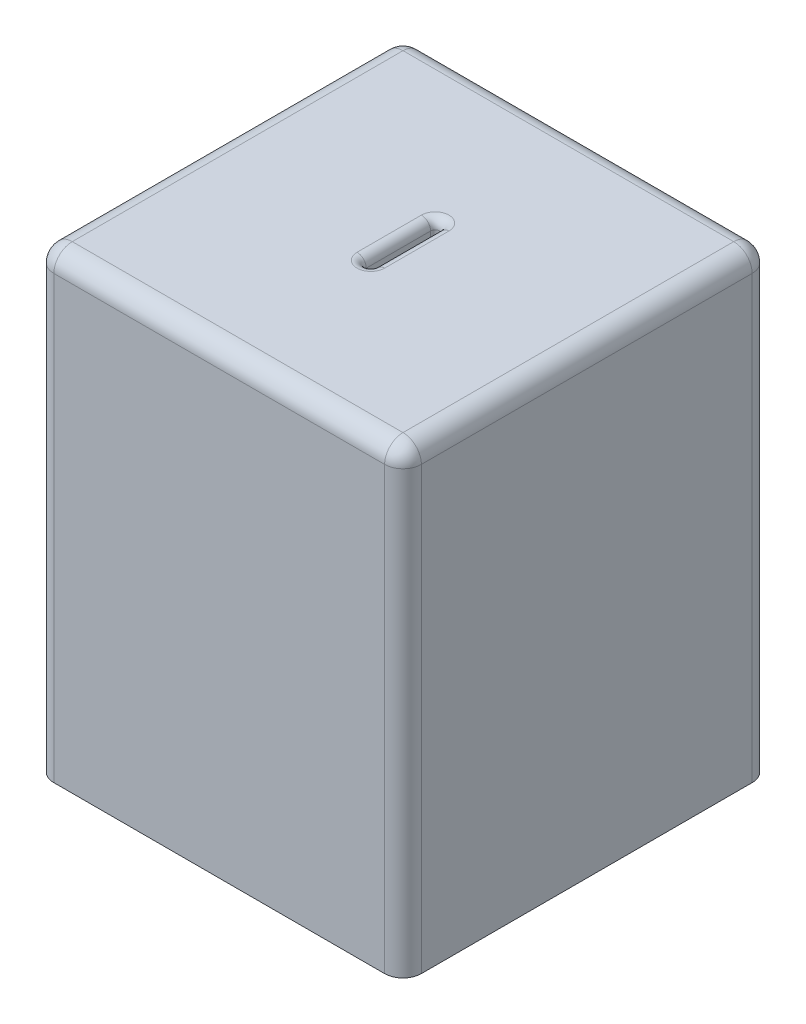
ISO-10303-21;
HEADER;
FILE_DESCRIPTION(('STEP AP214'),'2;1');
FILE_NAME('part.step','',(''),(''),'','','');
FILE_SCHEMA(('AUTOMOTIVE_DESIGN { 1 0 10303 214 1 1 1 1 }'));
ENDSEC;
DATA;
#1=APPLICATION_CONTEXT('core data for automotive mechanical design processes');
#2=APPLICATION_PROTOCOL_DEFINITION('international standard','automotive_design',2000,#1);
#3=PRODUCT_CONTEXT('',#1,'mechanical');
#4=PRODUCT('Part','Part','',(#3));
#5=PRODUCT_RELATED_PRODUCT_CATEGORY('part','',(#4));
#6=PRODUCT_DEFINITION_FORMATION('','',#4);
#7=PRODUCT_DEFINITION_CONTEXT('part definition',#1,'design');
#8=PRODUCT_DEFINITION('design','',#6,#7);
#9=PRODUCT_DEFINITION_SHAPE('','',#8);
#10=(LENGTH_UNIT() NAMED_UNIT(*) SI_UNIT(.MILLI.,.METRE.));
#11=(NAMED_UNIT(*) PLANE_ANGLE_UNIT() SI_UNIT($,.RADIAN.));
#12=(NAMED_UNIT(*) SI_UNIT($,.STERADIAN.) SOLID_ANGLE_UNIT());
#13=UNCERTAINTY_MEASURE_WITH_UNIT(LENGTH_MEASURE(1.E-05),#10,'distance_accuracy_value','');
#14=(GEOMETRIC_REPRESENTATION_CONTEXT(3) GLOBAL_UNCERTAINTY_ASSIGNED_CONTEXT((#13)) GLOBAL_UNIT_ASSIGNED_CONTEXT((#10,
#11,#12)) REPRESENTATION_CONTEXT('',''));
#15=CARTESIAN_POINT('',(0.,0.,0.));
#16=DIRECTION('',(0.,0.,1.));
#17=DIRECTION('',(1.,0.,0.));
#18=AXIS2_PLACEMENT_3D('',#15,#16,#17);
#19=CARTESIAN_POINT('',(-51.8384401114206,250.,-103.064066852368));
#20=DIRECTION('',(1.,0.,0.));
#21=DIRECTION('',(0.,0.,-1.));
#22=AXIS2_PLACEMENT_3D('',#19,#20,#21);
#23=PLANE('',#22);
#24=DIRECTION('',(0.,0.,1.));
#25=VECTOR('',#24,1.);
#26=CARTESIAN_POINT('',(-51.8384401114206,10.,-103.064066852368));
#27=LINE('',#26,#25);
#28=CARTESIAN_POINT('',(-51.8384401114206,10.,-93.0640668523677));
#29=VERTEX_POINT('',#28);
#30=CARTESIAN_POINT('',(-51.8384401114206,10.,86.9359331476323));
#31=VERTEX_POINT('',#30);
#32=EDGE_CURVE('E297',#29,#31,#27,.T.);
#33=ORIENTED_EDGE('',*,*,#32,.F.);
#34=DIRECTION('',(0.,-1.,0.));
#35=VECTOR('',#34,1.);
#36=CARTESIAN_POINT('',(-51.8384401114206,250.,-93.0640668523677));
#37=LINE('',#36,#35);
#38=CARTESIAN_POINT('',(-51.8384401114206,240.,-93.0640668523677));
#39=VERTEX_POINT('',#38);
#40=EDGE_CURVE('E376',#39,#29,#37,.T.);
#41=ORIENTED_EDGE('',*,*,#40,.F.);
#42=DIRECTION('',(0.,0.,1.));
#43=VECTOR('',#42,1.);
#44=CARTESIAN_POINT('',(-51.8384401114206,240.,-103.064066852368));
#45=LINE('',#44,#43);
#46=CARTESIAN_POINT('',(-51.8384401114206,240.,86.9359331476323));
#47=VERTEX_POINT('',#46);
#48=EDGE_CURVE('E343',#39,#47,#45,.T.);
#49=ORIENTED_EDGE('',*,*,#48,.T.);
#50=DIRECTION('',(0.,1.,0.));
#51=VECTOR('',#50,1.);
#52=CARTESIAN_POINT('',(-51.8384401114206,250.,86.9359331476323));
#53=LINE('',#52,#51);
#54=EDGE_CURVE('E380',#31,#47,#53,.T.);
#55=ORIENTED_EDGE('',*,*,#54,.F.);
#56=EDGE_LOOP('',(#33,#41,#49,#55));
#57=FACE_BOUND('',#56,.T.);
#58=ADVANCED_FACE('F45',(#57),#23,.T.);
#59=CARTESIAN_POINT('',(-61.8384401114206,250.,86.9359331476323));
#60=DIRECTION('',(0.,0.,-1.));
#61=DIRECTION('',(-1.,0.,0.));
#62=AXIS2_PLACEMENT_3D('',#59,#60,#61);
#63=PLANE('',#62);
#64=DIRECTION('',(1.,0.,0.));
#65=VECTOR('',#64,1.);
#66=CARTESIAN_POINT('',(-61.8384401114206,10.,86.9359331476323));
#67=LINE('',#66,#65);
#68=CARTESIAN_POINT('',(128.161559888579,10.,86.9359331476323));
#69=VERTEX_POINT('',#68);
#70=EDGE_CURVE('E373',#31,#69,#67,.T.);
#71=ORIENTED_EDGE('',*,*,#70,.F.);
#72=ORIENTED_EDGE('',*,*,#54,.T.);
#73=DIRECTION('',(-1.,0.,0.));
#74=VECTOR('',#73,1.);
#75=CARTESIAN_POINT('',(0.,240.,86.9359331476323));
#76=LINE('',#75,#74);
#77=CARTESIAN_POINT('',(128.161559888579,240.,86.9359331476323));
#78=VERTEX_POINT('',#77);
#79=EDGE_CURVE('E369',#78,#47,#76,.T.);
#80=ORIENTED_EDGE('',*,*,#79,.F.);
#81=DIRECTION('',(0.,-1.,0.));
#82=VECTOR('',#81,1.);
#83=CARTESIAN_POINT('',(128.161559888579,250.,86.9359331476323));
#84=LINE('',#83,#82);
#85=EDGE_CURVE('E354',#78,#69,#84,.T.);
#86=ORIENTED_EDGE('',*,*,#85,.T.);
#87=EDGE_LOOP('',(#71,#72,#80,#86));
#88=FACE_BOUND('',#87,.T.);
#89=ADVANCED_FACE('F532',(#88),#63,.T.);
#90=CARTESIAN_POINT('',(128.161559888579,250.,-103.064066852368));
#91=DIRECTION('',(-1.,0.,0.));
#92=DIRECTION('',(0.,0.,1.));
#93=AXIS2_PLACEMENT_3D('',#90,#91,#92);
#94=PLANE('',#93);
#95=DIRECTION('',(0.,0.,-1.));
#96=VECTOR('',#95,1.);
#97=CARTESIAN_POINT('',(128.161559888579,10.,-103.064066852368));
#98=LINE('',#97,#96);
#99=CARTESIAN_POINT('',(128.161559888579,10.,-93.0640668523677));
#100=VERTEX_POINT('',#99);
#101=EDGE_CURVE('E366',#69,#100,#98,.T.);
#102=ORIENTED_EDGE('',*,*,#101,.F.);
#103=ORIENTED_EDGE('',*,*,#85,.F.);
#104=DIRECTION('',(0.,0.,1.));
#105=VECTOR('',#104,1.);
#106=CARTESIAN_POINT('',(128.161559888579,240.,0.));
#107=LINE('',#106,#105);
#108=CARTESIAN_POINT('',(128.161559888579,240.,-93.0640668523677));
#109=VERTEX_POINT('',#108);
#110=EDGE_CURVE('E358',#109,#78,#107,.T.);
#111=ORIENTED_EDGE('',*,*,#110,.F.);
#112=DIRECTION('',(0.,1.,0.));
#113=VECTOR('',#112,1.);
#114=CARTESIAN_POINT('',(128.161559888579,250.,-93.0640668523677));
#115=LINE('',#114,#113);
#116=EDGE_CURVE('E362',#100,#109,#115,.T.);
#117=ORIENTED_EDGE('',*,*,#116,.F.);
#118=EDGE_LOOP('',(#102,#103,#111,#117));
#119=FACE_BOUND('',#118,.T.);
#120=ADVANCED_FACE('F539',(#119),#94,.T.);
#121=CARTESIAN_POINT('',(-61.8384401114206,250.,-93.0640668523677));
#122=DIRECTION('',(0.,0.,1.));
#123=DIRECTION('',(1.,0.,0.));
#124=AXIS2_PLACEMENT_3D('',#121,#122,#123);
#125=PLANE('',#124);
#126=DIRECTION('',(-1.,0.,0.));
#127=VECTOR('',#126,1.);
#128=CARTESIAN_POINT('',(-61.8384401114206,240.,-93.0640668523677));
#129=LINE('',#128,#127);
#130=EDGE_CURVE('E347',#109,#39,#129,.T.);
#131=ORIENTED_EDGE('',*,*,#130,.T.);
#132=ORIENTED_EDGE('',*,*,#40,.T.);
#133=DIRECTION('',(-1.,0.,0.));
#134=VECTOR('',#133,1.);
#135=CARTESIAN_POINT('',(-61.8384401114206,10.,-93.0640668523677));
#136=LINE('',#135,#134);
#137=EDGE_CURVE('E351',#100,#29,#136,.T.);
#138=ORIENTED_EDGE('',*,*,#137,.F.);
#139=ORIENTED_EDGE('',*,*,#116,.T.);
#140=EDGE_LOOP('',(#131,#132,#138,#139));
#141=FACE_BOUND('',#140,.T.);
#142=ADVANCED_FACE('F548',(#141),#125,.T.);
#143=CARTESIAN_POINT('',(0.,240.,0.));
#144=DIRECTION('',(0.,1.,0.));
#145=DIRECTION('',(0.,0.,1.));
#146=AXIS2_PLACEMENT_3D('',#143,#144,#145);
#147=PLANE('',#146);
#148=DIRECTION('',(0.,0.,1.));
#149=VECTOR('',#148,1.);
#150=CARTESIAN_POINT('',(40.6615598885794,240.,-20.5640668523677));
#151=LINE('',#150,#149);
#152=CARTESIAN_POINT('',(40.6615598885794,240.,-20.5640668523677));
#153=VERTEX_POINT('',#152);
#154=CARTESIAN_POINT('',(40.6615598885794,240.,14.4359331476323));
#155=VERTEX_POINT('',#154);
#156=EDGE_CURVE('E185',#153,#155,#151,.T.);
#157=ORIENTED_EDGE('',*,*,#156,.F.);
#158=CARTESIAN_POINT('',(38.1615598885794,240.,-20.5640668523677));
#159=DIRECTION('',(0.,1.,0.));
#160=DIRECTION('',(0.,0.,1.));
#161=AXIS2_PLACEMENT_3D('',#158,#159,#160);
#162=CIRCLE('',#161,2.5);
#163=CARTESIAN_POINT('',(35.6615598885794,240.,-20.5640668523677));
#164=VERTEX_POINT('',#163);
#165=EDGE_CURVE('E192',#164,#153,#162,.F.);
#166=ORIENTED_EDGE('',*,*,#165,.F.);
#167=DIRECTION('',(0.,0.,-1.));
#168=VECTOR('',#167,1.);
#169=CARTESIAN_POINT('',(35.6615598885794,240.,-20.5640668523677));
#170=LINE('',#169,#168);
#171=CARTESIAN_POINT('',(35.6615598885794,240.,14.4359331476323));
#172=VERTEX_POINT('',#171);
#173=EDGE_CURVE('E198',#172,#164,#170,.T.);
#174=ORIENTED_EDGE('',*,*,#173,.F.);
#175=CARTESIAN_POINT('',(38.1615598885794,240.,14.4359331476323));
#176=DIRECTION('',(0.,1.,0.));
#177=DIRECTION('',(0.,0.,1.));
#178=AXIS2_PLACEMENT_3D('',#175,#176,#177);
#179=CIRCLE('',#178,2.5);
#180=EDGE_CURVE('E202',#155,#172,#179,.F.);
#181=ORIENTED_EDGE('',*,*,#180,.F.);
#182=EDGE_LOOP('',(#157,#166,#174,#181));
#183=FACE_BOUND('',#182,.T.);
#184=ORIENTED_EDGE('',*,*,#79,.T.);
#185=ORIENTED_EDGE('',*,*,#48,.F.);
#186=ORIENTED_EDGE('',*,*,#130,.F.);
#187=ORIENTED_EDGE('',*,*,#110,.T.);
#188=EDGE_LOOP('',(#184,#185,#186,#187));
#189=FACE_BOUND('',#188,.T.);
#190=ADVANCED_FACE('F200',(#183,#189),#147,.F.);
#191=CARTESIAN_POINT('',(0.,10.,0.));
#192=DIRECTION('',(0.,1.,0.));
#193=DIRECTION('',(0.,0.,1.));
#194=AXIS2_PLACEMENT_3D('',#191,#192,#193);
#195=PLANE('',#194);
#196=CARTESIAN_POINT('',(38.1615598885794,10.,-3.06406685236769));
#197=DIRECTION('',(0.,1.,0.));
#198=DIRECTION('',(0.,0.,1.));
#199=AXIS2_PLACEMENT_3D('',#196,#197,#198);
#200=CIRCLE('',#199,20.);
#201=CARTESIAN_POINT('',(38.1615598885794,10.,16.9359331476323));
#202=VERTEX_POINT('',#201);
#203=EDGE_CURVE('E432',#202,#202,#200,.F.);
#204=ORIENTED_EDGE('',*,*,#203,.T.);
#205=EDGE_LOOP('',(#204));
#206=FACE_BOUND('',#205,.T.);
#207=ORIENTED_EDGE('',*,*,#137,.T.);
#208=ORIENTED_EDGE('',*,*,#32,.T.);
#209=ORIENTED_EDGE('',*,*,#70,.T.);
#210=ORIENTED_EDGE('',*,*,#101,.T.);
#211=EDGE_LOOP('',(#207,#208,#209,#210));
#212=FACE_BOUND('',#211,.T.);
#213=ADVANCED_FACE('F437',(#206,#212),#195,.T.);
#214=CARTESIAN_POINT('',(38.1615598885794,-0.000999999999973245,-20.5640668523677));
#215=DIRECTION('',(0.,1.,0.));
#216=DIRECTION('',(0.,0.,1.));
#217=AXIS2_PLACEMENT_3D('',#214,#215,#216);
#218=CYLINDRICAL_SURFACE('',#217,2.5);
#219=DIRECTION('',(0.,1.,0.));
#220=VECTOR('',#219,1.);
#221=CARTESIAN_POINT('',(40.6615598885794,-0.000999999999973245,-20.5640668523677));
#222=LINE('',#221,#220);
#223=CARTESIAN_POINT('',(40.6615598885794,245.,-20.5640668523677));
#224=VERTEX_POINT('',#223);
#225=EDGE_CURVE('E181',#153,#224,#222,.T.);
#226=ORIENTED_EDGE('',*,*,#225,.T.);
#227=CARTESIAN_POINT('',(38.1615598885794,245.,-20.5640668523677));
#228=DIRECTION('',(0.,1.,0.));
#229=DIRECTION('',(0.,0.,1.));
#230=AXIS2_PLACEMENT_3D('',#227,#228,#229);
#231=CIRCLE('',#230,2.5);
#232=CARTESIAN_POINT('',(35.6615598885794,245.,-20.5640668523677));
#233=VERTEX_POINT('',#232);
#234=EDGE_CURVE('E55',#224,#233,#231,.T.);
#235=ORIENTED_EDGE('',*,*,#234,.T.);
#236=DIRECTION('',(0.,1.,0.));
#237=VECTOR('',#236,1.);
#238=CARTESIAN_POINT('',(35.6615598885794,-0.000999999999973245,-20.5640668523677));
#239=LINE('',#238,#237);
#240=EDGE_CURVE('E189',#164,#233,#239,.T.);
#241=ORIENTED_EDGE('',*,*,#240,.F.);
#242=ORIENTED_EDGE('',*,*,#165,.T.);
#243=EDGE_LOOP('',(#226,#235,#241,#242));
#244=FACE_BOUND('',#243,.T.);
#245=ADVANCED_FACE('F193',(#244),#218,.F.);
#246=CARTESIAN_POINT('',(40.6615598885794,-0.000999999999973245,-20.5640668523677));
#247=DIRECTION('',(1.,0.,0.));
#248=DIRECTION('',(0.,0.,-1.));
#249=AXIS2_PLACEMENT_3D('',#246,#247,#248);
#250=PLANE('',#249);
#251=DIRECTION('',(0.,1.,0.));
#252=VECTOR('',#251,1.);
#253=CARTESIAN_POINT('',(40.6615598885794,-0.000999999999973245,14.4359331476323));
#254=LINE('',#253,#252);
#255=CARTESIAN_POINT('',(40.6615598885794,245.,14.4359331476323));
#256=VERTEX_POINT('',#255);
#257=EDGE_CURVE('E188',#155,#256,#254,.T.);
#258=ORIENTED_EDGE('',*,*,#257,.T.);
#259=DIRECTION('',(0.,0.,-1.));
#260=VECTOR('',#259,1.);
#261=CARTESIAN_POINT('',(40.6615598885794,245.,-20.5640668523677));
#262=LINE('',#261,#260);
#263=EDGE_CURVE('E11',#256,#224,#262,.T.);
#264=ORIENTED_EDGE('',*,*,#263,.T.);
#265=ORIENTED_EDGE('',*,*,#225,.F.);
#266=ORIENTED_EDGE('',*,*,#156,.T.);
#267=EDGE_LOOP('',(#258,#264,#265,#266));
#268=FACE_BOUND('',#267,.T.);
#269=ADVANCED_FACE('F183',(#268),#250,.F.);
#270=CARTESIAN_POINT('',(38.1615598885794,-0.000999999999973245,14.4359331476323));
#271=DIRECTION('',(0.,1.,0.));
#272=DIRECTION('',(0.,0.,1.));
#273=AXIS2_PLACEMENT_3D('',#270,#271,#272);
#274=CYLINDRICAL_SURFACE('',#273,2.5);
#275=DIRECTION('',(0.,1.,0.));
#276=VECTOR('',#275,1.);
#277=CARTESIAN_POINT('',(35.6615598885794,-0.000999999999973245,14.4359331476323));
#278=LINE('',#277,#276);
#279=CARTESIAN_POINT('',(35.6615598885794,245.,14.4359331476323));
#280=VERTEX_POINT('',#279);
#281=EDGE_CURVE('E211',#172,#280,#278,.T.);
#282=ORIENTED_EDGE('',*,*,#281,.T.);
#283=CARTESIAN_POINT('',(38.1615598885794,245.,14.4359331476323));
#284=DIRECTION('',(0.,1.,0.));
#285=DIRECTION('',(0.,0.,1.));
#286=AXIS2_PLACEMENT_3D('',#283,#284,#285);
#287=CIRCLE('',#286,2.5);
#288=EDGE_CURVE('E346',#280,#256,#287,.T.);
#289=ORIENTED_EDGE('',*,*,#288,.T.);
#290=ORIENTED_EDGE('',*,*,#257,.F.);
#291=ORIENTED_EDGE('',*,*,#180,.T.);
#292=EDGE_LOOP('',(#282,#289,#290,#291));
#293=FACE_BOUND('',#292,.T.);
#294=ADVANCED_FACE('F528',(#293),#274,.F.);
#295=CARTESIAN_POINT('',(35.6615598885794,-0.000999999999973245,-20.5640668523677));
#296=DIRECTION('',(-1.,0.,0.));
#297=DIRECTION('',(0.,0.,1.));
#298=AXIS2_PLACEMENT_3D('',#295,#296,#297);
#299=PLANE('',#298);
#300=ORIENTED_EDGE('',*,*,#240,.T.);
#301=DIRECTION('',(0.,0.,1.));
#302=VECTOR('',#301,1.);
#303=CARTESIAN_POINT('',(35.6615598885794,245.,14.4359331476323));
#304=LINE('',#303,#302);
#305=EDGE_CURVE('E402',#233,#280,#304,.T.);
#306=ORIENTED_EDGE('',*,*,#305,.T.);
#307=ORIENTED_EDGE('',*,*,#281,.F.);
#308=ORIENTED_EDGE('',*,*,#173,.T.);
#309=EDGE_LOOP('',(#300,#306,#307,#308));
#310=FACE_BOUND('',#309,.T.);
#311=ADVANCED_FACE('F521',(#310),#299,.F.);
#312=CARTESIAN_POINT('',(-61.8384401114206,250.,-103.064066852368));
#313=DIRECTION('',(1.,0.,0.));
#314=DIRECTION('',(0.,0.,-1.));
#315=AXIS2_PLACEMENT_3D('',#312,#313,#314);
#316=PLANE('',#315);
#317=DIRECTION('',(0.,0.,1.));
#318=VECTOR('',#317,1.);
#319=CARTESIAN_POINT('',(-61.8384401114206,0.,-103.064066852368));
#320=LINE('',#319,#318);
#321=CARTESIAN_POINT('',(-61.8384401114206,0.,-93.0640668523677));
#322=VERTEX_POINT('',#321);
#323=CARTESIAN_POINT('',(-61.8384401114206,0.,86.9359331476323));
#324=VERTEX_POINT('',#323);
#325=EDGE_CURVE('E218',#322,#324,#320,.T.);
#326=ORIENTED_EDGE('',*,*,#325,.T.);
#327=DIRECTION('',(0.,-1.,0.));
#328=VECTOR('',#327,1.);
#329=CARTESIAN_POINT('',(-61.8384401114206,250.,86.9359331476323));
#330=LINE('',#329,#328);
#331=CARTESIAN_POINT('',(-61.8384401114206,240.,86.9359331476323));
#332=VERTEX_POINT('',#331);
#333=EDGE_CURVE('E281',#324,#332,#330,.F.);
#334=ORIENTED_EDGE('',*,*,#333,.T.);
#335=DIRECTION('',(0.,0.,1.));
#336=VECTOR('',#335,1.);
#337=CARTESIAN_POINT('',(-61.8384401114206,240.,-103.064066852368));
#338=LINE('',#337,#336);
#339=CARTESIAN_POINT('',(-61.8384401114206,240.,-93.0640668523677));
#340=VERTEX_POINT('',#339);
#341=EDGE_CURVE('E275',#332,#340,#338,.F.);
#342=ORIENTED_EDGE('',*,*,#341,.T.);
#343=DIRECTION('',(0.,-1.,0.));
#344=VECTOR('',#343,1.);
#345=CARTESIAN_POINT('',(-61.8384401114206,250.,-93.0640668523677));
#346=LINE('',#345,#344);
#347=EDGE_CURVE('E278',#340,#322,#346,.T.);
#348=ORIENTED_EDGE('',*,*,#347,.T.);
#349=EDGE_LOOP('',(#326,#334,#342,#348));
#350=FACE_BOUND('',#349,.T.);
#351=ADVANCED_FACE('F519',(#350),#316,.F.);
#352=CARTESIAN_POINT('',(-61.8384401114206,250.,96.9359331476323));
#353=DIRECTION('',(0.,0.,-1.));
#354=DIRECTION('',(-1.,0.,0.));
#355=AXIS2_PLACEMENT_3D('',#352,#353,#354);
#356=PLANE('',#355);
#357=DIRECTION('',(1.,0.,0.));
#358=VECTOR('',#357,1.);
#359=CARTESIAN_POINT('',(-61.8384401114206,0.,96.9359331476323));
#360=LINE('',#359,#358);
#361=CARTESIAN_POINT('',(-51.8384401114206,0.,96.9359331476323));
#362=VERTEX_POINT('',#361);
#363=CARTESIAN_POINT('',(128.161559888579,0.,96.9359331476323));
#364=VERTEX_POINT('',#363);
#365=EDGE_CURVE('E222',#362,#364,#360,.T.);
#366=ORIENTED_EDGE('',*,*,#365,.T.);
#367=DIRECTION('',(0.,-1.,0.));
#368=VECTOR('',#367,1.);
#369=CARTESIAN_POINT('',(128.161559888579,250.,96.9359331476323));
#370=LINE('',#369,#368);
#371=CARTESIAN_POINT('',(128.161559888579,240.,96.9359331476323));
#372=VERTEX_POINT('',#371);
#373=EDGE_CURVE('E272',#364,#372,#370,.F.);
#374=ORIENTED_EDGE('',*,*,#373,.T.);
#375=DIRECTION('',(1.,0.,0.));
#376=VECTOR('',#375,1.);
#377=CARTESIAN_POINT('',(-61.8384401114206,240.,96.9359331476323));
#378=LINE('',#377,#376);
#379=CARTESIAN_POINT('',(-51.8384401114206,240.,96.9359331476323));
#380=VERTEX_POINT('',#379);
#381=EDGE_CURVE('E266',#372,#380,#378,.F.);
#382=ORIENTED_EDGE('',*,*,#381,.T.);
#383=DIRECTION('',(0.,-1.,0.));
#384=VECTOR('',#383,1.);
#385=CARTESIAN_POINT('',(-51.8384401114206,250.,96.9359331476323));
#386=LINE('',#385,#384);
#387=EDGE_CURVE('E269',#380,#362,#386,.T.);
#388=ORIENTED_EDGE('',*,*,#387,.T.);
#389=EDGE_LOOP('',(#366,#374,#382,#388));
#390=FACE_BOUND('',#389,.T.);
#391=ADVANCED_FACE('F500',(#390),#356,.F.);
#392=CARTESIAN_POINT('',(138.161559888579,250.,-103.064066852368));
#393=DIRECTION('',(-1.,0.,0.));
#394=DIRECTION('',(0.,0.,1.));
#395=AXIS2_PLACEMENT_3D('',#392,#393,#394);
#396=PLANE('',#395);
#397=DIRECTION('',(0.,0.,-1.));
#398=VECTOR('',#397,1.);
#399=CARTESIAN_POINT('',(138.161559888579,0.,-103.064066852368));
#400=LINE('',#399,#398);
#401=CARTESIAN_POINT('',(138.161559888579,0.,86.9359331476323));
#402=VERTEX_POINT('',#401);
#403=CARTESIAN_POINT('',(138.161559888579,0.,-93.0640668523677));
#404=VERTEX_POINT('',#403);
#405=EDGE_CURVE('E227',#402,#404,#400,.T.);
#406=ORIENTED_EDGE('',*,*,#405,.T.);
#407=DIRECTION('',(0.,-1.,0.));
#408=VECTOR('',#407,1.);
#409=CARTESIAN_POINT('',(138.161559888579,250.,-93.0640668523677));
#410=LINE('',#409,#408);
#411=CARTESIAN_POINT('',(138.161559888579,240.,-93.0640668523677));
#412=VERTEX_POINT('',#411);
#413=EDGE_CURVE('E263',#404,#412,#410,.F.);
#414=ORIENTED_EDGE('',*,*,#413,.T.);
#415=DIRECTION('',(0.,0.,-1.));
#416=VECTOR('',#415,1.);
#417=CARTESIAN_POINT('',(138.161559888579,240.,96.9359331476323));
#418=LINE('',#417,#416);
#419=CARTESIAN_POINT('',(138.161559888579,240.,86.9359331476323));
#420=VERTEX_POINT('',#419);
#421=EDGE_CURVE('E257',#412,#420,#418,.F.);
#422=ORIENTED_EDGE('',*,*,#421,.T.);
#423=DIRECTION('',(0.,-1.,0.));
#424=VECTOR('',#423,1.);
#425=CARTESIAN_POINT('',(138.161559888579,250.,86.9359331476323));
#426=LINE('',#425,#424);
#427=EDGE_CURVE('E260',#420,#402,#426,.T.);
#428=ORIENTED_EDGE('',*,*,#427,.T.);
#429=EDGE_LOOP('',(#406,#414,#422,#428));
#430=FACE_BOUND('',#429,.T.);
#431=ADVANCED_FACE('F483',(#430),#396,.F.);
#432=CARTESIAN_POINT('',(-61.8384401114206,250.,-103.064066852368));
#433=DIRECTION('',(0.,0.,1.));
#434=DIRECTION('',(1.,0.,0.));
#435=AXIS2_PLACEMENT_3D('',#432,#433,#434);
#436=PLANE('',#435);
#437=DIRECTION('',(-1.,0.,0.));
#438=VECTOR('',#437,1.);
#439=CARTESIAN_POINT('',(138.161559888579,240.,-103.064066852368));
#440=LINE('',#439,#438);
#441=CARTESIAN_POINT('',(-51.8384401114206,240.,-103.064066852368));
#442=VERTEX_POINT('',#441);
#443=CARTESIAN_POINT('',(128.161559888579,240.,-103.064066852368));
#444=VERTEX_POINT('',#443);
#445=EDGE_CURVE('E235',#442,#444,#440,.F.);
#446=ORIENTED_EDGE('',*,*,#445,.T.);
#447=DIRECTION('',(0.,-1.,0.));
#448=VECTOR('',#447,1.);
#449=CARTESIAN_POINT('',(128.161559888579,250.,-103.064066852368));
#450=LINE('',#449,#448);
#451=CARTESIAN_POINT('',(128.161559888579,0.,-103.064066852368));
#452=VERTEX_POINT('',#451);
#453=EDGE_CURVE('E241',#444,#452,#450,.T.);
#454=ORIENTED_EDGE('',*,*,#453,.T.);
#455=DIRECTION('',(-1.,0.,0.));
#456=VECTOR('',#455,1.);
#457=CARTESIAN_POINT('',(-61.8384401114206,0.,-103.064066852368));
#458=LINE('',#457,#456);
#459=CARTESIAN_POINT('',(-51.8384401114206,0.,-103.064066852368));
#460=VERTEX_POINT('',#459);
#461=EDGE_CURVE('E231',#452,#460,#458,.T.);
#462=ORIENTED_EDGE('',*,*,#461,.T.);
#463=DIRECTION('',(0.,-1.,0.));
#464=VECTOR('',#463,1.);
#465=CARTESIAN_POINT('',(-51.8384401114206,250.,-103.064066852368));
#466=LINE('',#465,#464);
#467=EDGE_CURVE('E238',#460,#442,#466,.F.);
#468=ORIENTED_EDGE('',*,*,#467,.T.);
#469=EDGE_LOOP('',(#446,#454,#462,#468));
#470=FACE_BOUND('',#469,.T.);
#471=ADVANCED_FACE('F459',(#470),#436,.F.);
#472=CARTESIAN_POINT('',(0.,250.,0.));
#473=DIRECTION('',(0.,1.,0.));
#474=DIRECTION('',(0.,0.,1.));
#475=AXIS2_PLACEMENT_3D('',#472,#473,#474);
#476=PLANE('',#475);
#477=DIRECTION('',(0.,0.,-1.));
#478=VECTOR('',#477,1.);
#479=CARTESIAN_POINT('',(45.6615598885794,250.,14.4359331476323));
#480=LINE('',#479,#478);
#481=CARTESIAN_POINT('',(45.6615598885794,250.,-20.5640668523677));
#482=VERTEX_POINT('',#481);
#483=CARTESIAN_POINT('',(45.6615598885794,250.,14.4359331476323));
#484=VERTEX_POINT('',#483);
#485=EDGE_CURVE('E389',#482,#484,#480,.F.);
#486=ORIENTED_EDGE('',*,*,#485,.T.);
#487=CARTESIAN_POINT('',(38.1615598885794,250.,14.4359331476323));
#488=DIRECTION('',(0.,1.,0.));
#489=DIRECTION('',(0.,0.,1.));
#490=AXIS2_PLACEMENT_3D('',#487,#488,#489);
#491=CIRCLE('',#490,7.5);
#492=CARTESIAN_POINT('',(30.6615598885794,250.,14.4359331476323));
#493=VERTEX_POINT('',#492);
#494=EDGE_CURVE('E398',#484,#493,#491,.F.);
#495=ORIENTED_EDGE('',*,*,#494,.T.);
#496=DIRECTION('',(0.,0.,1.));
#497=VECTOR('',#496,1.);
#498=CARTESIAN_POINT('',(30.6615598885794,250.,-20.5640668523677));
#499=LINE('',#498,#497);
#500=CARTESIAN_POINT('',(30.6615598885794,250.,-20.5640668523677));
#501=VERTEX_POINT('',#500);
#502=EDGE_CURVE('E395',#493,#501,#499,.F.);
#503=ORIENTED_EDGE('',*,*,#502,.T.);
#504=CARTESIAN_POINT('',(38.1615598885794,250.,-20.5640668523677));
#505=DIRECTION('',(0.,1.,0.));
#506=DIRECTION('',(0.,0.,1.));
#507=AXIS2_PLACEMENT_3D('',#504,#505,#506);
#508=CIRCLE('',#507,7.5);
#509=EDGE_CURVE('E392',#501,#482,#508,.F.);
#510=ORIENTED_EDGE('',*,*,#509,.T.);
#511=EDGE_LOOP('',(#486,#495,#503,#510));
#512=FACE_BOUND('',#511,.T.);
#513=DIRECTION('',(1.,0.,0.));
#514=VECTOR('',#513,1.);
#515=CARTESIAN_POINT('',(138.161559888579,250.,86.9359331476323));
#516=LINE('',#515,#514);
#517=CARTESIAN_POINT('',(-51.8384401114206,250.,86.9359331476323));
#518=VERTEX_POINT('',#517);
#519=CARTESIAN_POINT('',(128.161559888579,250.,86.9359331476323));
#520=VERTEX_POINT('',#519);
#521=EDGE_CURVE('E284',#518,#520,#516,.T.);
#522=ORIENTED_EDGE('',*,*,#521,.T.);
#523=DIRECTION('',(0.,0.,-1.));
#524=VECTOR('',#523,1.);
#525=CARTESIAN_POINT('',(128.161559888579,250.,-103.064066852368));
#526=LINE('',#525,#524);
#527=CARTESIAN_POINT('',(128.161559888579,250.,-93.0640668523677));
#528=VERTEX_POINT('',#527);
#529=EDGE_CURVE('E293',#520,#528,#526,.T.);
#530=ORIENTED_EDGE('',*,*,#529,.T.);
#531=DIRECTION('',(-1.,0.,0.));
#532=VECTOR('',#531,1.);
#533=CARTESIAN_POINT('',(-61.8384401114206,250.,-93.0640668523677));
#534=LINE('',#533,#532);
#535=CARTESIAN_POINT('',(-51.8384401114206,250.,-93.0640668523677));
#536=VERTEX_POINT('',#535);
#537=EDGE_CURVE('E290',#528,#536,#534,.T.);
#538=ORIENTED_EDGE('',*,*,#537,.T.);
#539=DIRECTION('',(0.,0.,1.));
#540=VECTOR('',#539,1.);
#541=CARTESIAN_POINT('',(-51.8384401114206,250.,96.9359331476323));
#542=LINE('',#541,#540);
#543=EDGE_CURVE('E287',#536,#518,#542,.T.);
#544=ORIENTED_EDGE('',*,*,#543,.T.);
#545=EDGE_LOOP('',(#522,#530,#538,#544));
#546=FACE_BOUND('',#545,.T.);
#547=ADVANCED_FACE('F451',(#512,#546),#476,.T.);
#548=CARTESIAN_POINT('',(0.,0.,0.));
#549=DIRECTION('',(0.,1.,0.));
#550=DIRECTION('',(0.,0.,1.));
#551=AXIS2_PLACEMENT_3D('',#548,#549,#550);
#552=PLANE('',#551);
#553=CARTESIAN_POINT('',(38.1615598885794,0.,-3.06406685236769));
#554=DIRECTION('',(0.,-1.,0.));
#555=DIRECTION('',(0.,0.,-1.));
#556=AXIS2_PLACEMENT_3D('',#553,#554,#555);
#557=CIRCLE('',#556,20.);
#558=CARTESIAN_POINT('',(38.1615598885794,0.,-23.0640668523677));
#559=VERTEX_POINT('',#558);
#560=EDGE_CURVE('E411',#559,#559,#557,.T.);
#561=ORIENTED_EDGE('',*,*,#560,.F.);
#562=EDGE_LOOP('',(#561));
#563=FACE_BOUND('',#562,.T.);
#564=ORIENTED_EDGE('',*,*,#461,.F.);
#565=CARTESIAN_POINT('',(128.161559888579,0.,-93.0640668523677));
#566=DIRECTION('',(0.,1.,0.));
#567=DIRECTION('',(0.,0.,1.));
#568=AXIS2_PLACEMENT_3D('',#565,#566,#567);
#569=CIRCLE('',#568,10.);
#570=EDGE_CURVE('E254',#452,#404,#569,.F.);
#571=ORIENTED_EDGE('',*,*,#570,.T.);
#572=ORIENTED_EDGE('',*,*,#405,.F.);
#573=CARTESIAN_POINT('',(128.161559888579,0.,86.9359331476323));
#574=DIRECTION('',(0.,1.,0.));
#575=DIRECTION('',(0.,0.,1.));
#576=AXIS2_PLACEMENT_3D('',#573,#574,#575);
#577=CIRCLE('',#576,10.);
#578=EDGE_CURVE('E251',#402,#364,#577,.F.);
#579=ORIENTED_EDGE('',*,*,#578,.T.);
#580=ORIENTED_EDGE('',*,*,#365,.F.);
#581=CARTESIAN_POINT('',(-51.8384401114206,0.,86.9359331476323));
#582=DIRECTION('',(0.,1.,0.));
#583=DIRECTION('',(0.,0.,1.));
#584=AXIS2_PLACEMENT_3D('',#581,#582,#583);
#585=CIRCLE('',#584,10.);
#586=EDGE_CURVE('E248',#362,#324,#585,.F.);
#587=ORIENTED_EDGE('',*,*,#586,.T.);
#588=ORIENTED_EDGE('',*,*,#325,.F.);
#589=CARTESIAN_POINT('',(-51.8384401114206,0.,-93.0640668523677));
#590=DIRECTION('',(0.,1.,0.));
#591=DIRECTION('',(0.,0.,1.));
#592=AXIS2_PLACEMENT_3D('',#589,#590,#591);
#593=CIRCLE('',#592,10.);
#594=EDGE_CURVE('E245',#322,#460,#593,.F.);
#595=ORIENTED_EDGE('',*,*,#594,.T.);
#596=EDGE_LOOP('',(#564,#571,#572,#579,#580,#587,#588,#595));
#597=FACE_BOUND('',#596,.T.);
#598=ADVANCED_FACE('F447',(#563,#597),#552,.F.);
#599=CARTESIAN_POINT('',(-51.8384401114206,250.,86.9359331476323));
#600=DIRECTION('',(0.,-1.,0.));
#601=DIRECTION('',(0.,0.,-1.));
#602=AXIS2_PLACEMENT_3D('',#599,#600,#601);
#603=CYLINDRICAL_SURFACE('',#602,10.);
#604=CARTESIAN_POINT('',(-51.8384401114206,240.,86.9359331476323));
#605=DIRECTION('',(0.,1.,0.));
#606=DIRECTION('',(0.,0.,1.));
#607=AXIS2_PLACEMENT_3D('',#604,#605,#606);
#608=CIRCLE('',#607,10.);
#609=EDGE_CURVE('E223',#332,#380,#608,.T.);
#610=ORIENTED_EDGE('',*,*,#609,.F.);
#611=ORIENTED_EDGE('',*,*,#333,.F.);
#612=ORIENTED_EDGE('',*,*,#586,.F.);
#613=ORIENTED_EDGE('',*,*,#387,.F.);
#614=EDGE_LOOP('',(#610,#611,#612,#613));
#615=FACE_BOUND('',#614,.T.);
#616=ADVANCED_FACE('F450',(#615),#603,.T.);
#617=CARTESIAN_POINT('',(-51.8384401114206,240.,86.9359331476323));
#618=DIRECTION('',(0.,0.,1.));
#619=DIRECTION('',(1.,0.,0.));
#620=AXIS2_PLACEMENT_3D('',#617,#618,#619);
#621=SPHERICAL_SURFACE('',#620,10.);
#622=CARTESIAN_POINT('',(-51.8384401114206,240.,86.9359331476323));
#623=DIRECTION('',(0.,0.,1.));
#624=DIRECTION('',(1.,0.,0.));
#625=AXIS2_PLACEMENT_3D('',#622,#623,#624);
#626=CIRCLE('',#625,10.);
#627=EDGE_CURVE('E332',#332,#518,#626,.F.);
#628=ORIENTED_EDGE('',*,*,#627,.F.);
#629=ORIENTED_EDGE('',*,*,#609,.T.);
#630=CARTESIAN_POINT('',(-51.8384401114206,240.,86.9359331476323));
#631=DIRECTION('',(-1.,0.,0.));
#632=DIRECTION('',(0.,0.,1.));
#633=AXIS2_PLACEMENT_3D('',#630,#631,#632);
#634=CIRCLE('',#633,10.);
#635=EDGE_CURVE('E336',#518,#380,#634,.F.);
#636=ORIENTED_EDGE('',*,*,#635,.F.);
#637=EDGE_LOOP('',(#628,#629,#636));
#638=FACE_BOUND('',#637,.T.);
#639=ADVANCED_FACE('F509',(#638),#621,.T.);
#640=CARTESIAN_POINT('',(128.161559888579,250.,86.9359331476323));
#641=DIRECTION('',(0.,-1.,0.));
#642=DIRECTION('',(0.,0.,-1.));
#643=AXIS2_PLACEMENT_3D('',#640,#641,#642);
#644=CYLINDRICAL_SURFACE('',#643,10.);
#645=ORIENTED_EDGE('',*,*,#578,.F.);
#646=ORIENTED_EDGE('',*,*,#427,.F.);
#647=CARTESIAN_POINT('',(128.161559888579,240.,86.9359331476323));
#648=DIRECTION('',(0.,1.,0.));
#649=DIRECTION('',(0.,0.,1.));
#650=AXIS2_PLACEMENT_3D('',#647,#648,#649);
#651=CIRCLE('',#650,10.);
#652=EDGE_CURVE('E328',#372,#420,#651,.T.);
#653=ORIENTED_EDGE('',*,*,#652,.F.);
#654=ORIENTED_EDGE('',*,*,#373,.F.);
#655=EDGE_LOOP('',(#645,#646,#653,#654));
#656=FACE_BOUND('',#655,.T.);
#657=ADVANCED_FACE('F496',(#656),#644,.T.);
#658=CARTESIAN_POINT('',(0.,240.,86.9359331476323));
#659=DIRECTION('',(-1.,0.,0.));
#660=DIRECTION('',(0.,0.,1.));
#661=AXIS2_PLACEMENT_3D('',#658,#659,#660);
#662=CYLINDRICAL_SURFACE('',#661,10.);
#663=ORIENTED_EDGE('',*,*,#635,.T.);
#664=ORIENTED_EDGE('',*,*,#381,.F.);
#665=CARTESIAN_POINT('',(128.161559888579,240.,86.9359331476323));
#666=DIRECTION('',(1.,0.,0.));
#667=DIRECTION('',(0.,0.,-1.));
#668=AXIS2_PLACEMENT_3D('',#665,#666,#667);
#669=CIRCLE('',#668,10.);
#670=EDGE_CURVE('E324',#520,#372,#669,.T.);
#671=ORIENTED_EDGE('',*,*,#670,.F.);
#672=ORIENTED_EDGE('',*,*,#521,.F.);
#673=EDGE_LOOP('',(#663,#664,#671,#672));
#674=FACE_BOUND('',#673,.T.);
#675=ADVANCED_FACE('F513',(#674),#662,.T.);
#676=CARTESIAN_POINT('',(-51.8384401114206,240.,0.));
#677=DIRECTION('',(0.,0.,-1.));
#678=DIRECTION('',(-1.,0.,0.));
#679=AXIS2_PLACEMENT_3D('',#676,#677,#678);
#680=CYLINDRICAL_SURFACE('',#679,10.);
#681=ORIENTED_EDGE('',*,*,#627,.T.);
#682=ORIENTED_EDGE('',*,*,#543,.F.);
#683=CARTESIAN_POINT('',(-51.8384401114206,240.,-93.0640668523677));
#684=DIRECTION('',(0.,0.,-1.));
#685=DIRECTION('',(-1.,0.,0.));
#686=AXIS2_PLACEMENT_3D('',#683,#684,#685);
#687=CIRCLE('',#686,10.);
#688=EDGE_CURVE('E320',#340,#536,#687,.T.);
#689=ORIENTED_EDGE('',*,*,#688,.F.);
#690=ORIENTED_EDGE('',*,*,#341,.F.);
#691=EDGE_LOOP('',(#681,#682,#689,#690));
#692=FACE_BOUND('',#691,.T.);
#693=ADVANCED_FACE('F517',(#692),#680,.T.);
#694=CARTESIAN_POINT('',(-51.8384401114206,250.,-93.0640668523677));
#695=DIRECTION('',(0.,-1.,0.));
#696=DIRECTION('',(0.,0.,-1.));
#697=AXIS2_PLACEMENT_3D('',#694,#695,#696);
#698=CYLINDRICAL_SURFACE('',#697,10.);
#699=ORIENTED_EDGE('',*,*,#594,.F.);
#700=ORIENTED_EDGE('',*,*,#347,.F.);
#701=CARTESIAN_POINT('',(-51.8384401114206,240.,-93.0640668523677));
#702=DIRECTION('',(0.,1.,0.));
#703=DIRECTION('',(0.,0.,1.));
#704=AXIS2_PLACEMENT_3D('',#701,#702,#703);
#705=CIRCLE('',#704,10.);
#706=EDGE_CURVE('E316',#442,#340,#705,.T.);
#707=ORIENTED_EDGE('',*,*,#706,.F.);
#708=ORIENTED_EDGE('',*,*,#467,.F.);
#709=EDGE_LOOP('',(#699,#700,#707,#708));
#710=FACE_BOUND('',#709,.T.);
#711=ADVANCED_FACE('F463',(#710),#698,.T.);
#712=CARTESIAN_POINT('',(128.161559888579,240.,86.9359331476323));
#713=DIRECTION('',(0.,0.,1.));
#714=DIRECTION('',(1.,0.,0.));
#715=AXIS2_PLACEMENT_3D('',#712,#713,#714);
#716=SPHERICAL_SURFACE('',#715,10.);
#717=ORIENTED_EDGE('',*,*,#670,.T.);
#718=ORIENTED_EDGE('',*,*,#652,.T.);
#719=CARTESIAN_POINT('',(128.161559888579,240.,86.9359331476323));
#720=DIRECTION('',(0.,0.,1.));
#721=DIRECTION('',(0.,-1.,0.));
#722=AXIS2_PLACEMENT_3D('',#719,#720,#721);
#723=CIRCLE('',#722,10.);
#724=EDGE_CURVE('E312',#520,#420,#723,.F.);
#725=ORIENTED_EDGE('',*,*,#724,.F.);
#726=EDGE_LOOP('',(#717,#718,#725));
#727=FACE_BOUND('',#726,.T.);
#728=ADVANCED_FACE('F490',(#727),#716,.T.);
#729=CARTESIAN_POINT('',(-51.8384401114206,240.,-93.0640668523677));
#730=DIRECTION('',(-1.,0.,0.));
#731=DIRECTION('',(0.,0.,1.));
#732=AXIS2_PLACEMENT_3D('',#729,#730,#731);
#733=SPHERICAL_SURFACE('',#732,10.);
#734=ORIENTED_EDGE('',*,*,#706,.T.);
#735=ORIENTED_EDGE('',*,*,#688,.T.);
#736=CARTESIAN_POINT('',(-51.8384401114206,240.,-93.0640668523677));
#737=DIRECTION('',(-1.,0.,0.));
#738=DIRECTION('',(0.,0.,1.));
#739=AXIS2_PLACEMENT_3D('',#736,#737,#738);
#740=CIRCLE('',#739,10.);
#741=EDGE_CURVE('E308',#442,#536,#740,.F.);
#742=ORIENTED_EDGE('',*,*,#741,.F.);
#743=EDGE_LOOP('',(#734,#735,#742));
#744=FACE_BOUND('',#743,.T.);
#745=ADVANCED_FACE('F469',(#744),#733,.T.);
#746=CARTESIAN_POINT('',(128.161559888579,240.,0.));
#747=DIRECTION('',(0.,0.,1.));
#748=DIRECTION('',(1.,0.,0.));
#749=AXIS2_PLACEMENT_3D('',#746,#747,#748);
#750=CYLINDRICAL_SURFACE('',#749,10.);
#751=ORIENTED_EDGE('',*,*,#724,.T.);
#752=ORIENTED_EDGE('',*,*,#421,.F.);
#753=CARTESIAN_POINT('',(128.161559888579,240.,-93.0640668523677));
#754=DIRECTION('',(0.,0.,-1.));
#755=DIRECTION('',(-1.,0.,0.));
#756=AXIS2_PLACEMENT_3D('',#753,#754,#755);
#757=CIRCLE('',#756,10.);
#758=EDGE_CURVE('E304',#528,#412,#757,.T.);
#759=ORIENTED_EDGE('',*,*,#758,.F.);
#760=ORIENTED_EDGE('',*,*,#529,.F.);
#761=EDGE_LOOP('',(#751,#752,#759,#760));
#762=FACE_BOUND('',#761,.T.);
#763=ADVANCED_FACE('F486',(#762),#750,.T.);
#764=CARTESIAN_POINT('',(0.,240.,-93.0640668523677));
#765=DIRECTION('',(1.,0.,0.));
#766=DIRECTION('',(0.,0.,-1.));
#767=AXIS2_PLACEMENT_3D('',#764,#765,#766);
#768=CYLINDRICAL_SURFACE('',#767,10.);
#769=ORIENTED_EDGE('',*,*,#741,.T.);
#770=ORIENTED_EDGE('',*,*,#537,.F.);
#771=CARTESIAN_POINT('',(128.161559888579,240.,-93.0640668523677));
#772=DIRECTION('',(1.,0.,0.));
#773=DIRECTION('',(0.,0.,-1.));
#774=AXIS2_PLACEMENT_3D('',#771,#772,#773);
#775=CIRCLE('',#774,10.);
#776=EDGE_CURVE('E301',#444,#528,#775,.T.);
#777=ORIENTED_EDGE('',*,*,#776,.F.);
#778=ORIENTED_EDGE('',*,*,#445,.F.);
#779=EDGE_LOOP('',(#769,#770,#777,#778));
#780=FACE_BOUND('',#779,.T.);
#781=ADVANCED_FACE('F473',(#780),#768,.T.);
#782=CARTESIAN_POINT('',(128.161559888579,240.,-93.0640668523677));
#783=DIRECTION('',(0.,1.,0.));
#784=DIRECTION('',(0.,0.,1.));
#785=AXIS2_PLACEMENT_3D('',#782,#783,#784);
#786=SPHERICAL_SURFACE('',#785,10.);
#787=ORIENTED_EDGE('',*,*,#776,.T.);
#788=ORIENTED_EDGE('',*,*,#758,.T.);
#789=CARTESIAN_POINT('',(128.161559888579,240.,-93.0640668523677));
#790=DIRECTION('',(0.,1.,0.));
#791=DIRECTION('',(0.,0.,1.));
#792=AXIS2_PLACEMENT_3D('',#789,#790,#791);
#793=CIRCLE('',#792,10.);
#794=EDGE_CURVE('E215',#444,#412,#793,.F.);
#795=ORIENTED_EDGE('',*,*,#794,.F.);
#796=EDGE_LOOP('',(#787,#788,#795));
#797=FACE_BOUND('',#796,.T.);
#798=ADVANCED_FACE('F477',(#797),#786,.T.);
#799=CARTESIAN_POINT('',(128.161559888579,250.,-93.0640668523677));
#800=DIRECTION('',(0.,-1.,0.));
#801=DIRECTION('',(0.,0.,-1.));
#802=AXIS2_PLACEMENT_3D('',#799,#800,#801);
#803=CYLINDRICAL_SURFACE('',#802,10.);
#804=ORIENTED_EDGE('',*,*,#794,.T.);
#805=ORIENTED_EDGE('',*,*,#413,.F.);
#806=ORIENTED_EDGE('',*,*,#570,.F.);
#807=ORIENTED_EDGE('',*,*,#453,.F.);
#808=EDGE_LOOP('',(#804,#805,#806,#807));
#809=FACE_BOUND('',#808,.T.);
#810=ADVANCED_FACE('F480',(#809),#803,.T.);
#811=CARTESIAN_POINT('',(38.1615598885794,245.,-20.5640668523677));
#812=DIRECTION('',(0.,1.,0.));
#813=DIRECTION('',(0.,0.,1.));
#814=AXIS2_PLACEMENT_3D('',#811,#812,#813);
#815=TOROIDAL_SURFACE('',#814,7.5,5.);
#816=CARTESIAN_POINT('',(45.6615598885794,245.,-20.5640668523677));
#817=DIRECTION('',(0.,0.,1.));
#818=DIRECTION('',(1.,0.,0.));
#819=AXIS2_PLACEMENT_3D('',#816,#817,#818);
#820=CIRCLE('',#819,5.);
#821=EDGE_CURVE('E413',#482,#224,#820,.T.);
#822=ORIENTED_EDGE('',*,*,#821,.F.);
#823=ORIENTED_EDGE('',*,*,#509,.F.);
#824=CARTESIAN_POINT('',(30.6615598885794,245.,-20.5640668523677));
#825=DIRECTION('',(0.,0.,1.));
#826=DIRECTION('',(1.,0.,0.));
#827=AXIS2_PLACEMENT_3D('',#824,#825,#826);
#828=CIRCLE('',#827,5.);
#829=EDGE_CURVE('E49',#233,#501,#828,.T.);
#830=ORIENTED_EDGE('',*,*,#829,.F.);
#831=ORIENTED_EDGE('',*,*,#234,.F.);
#832=EDGE_LOOP('',(#822,#823,#830,#831));
#833=FACE_BOUND('',#832,.T.);
#834=ADVANCED_FACE('F47',(#833),#815,.T.);
#835=CARTESIAN_POINT('',(30.6615598885794,245.,-20.5640668523677));
#836=DIRECTION('',(0.,0.,-1.));
#837=DIRECTION('',(-1.,0.,0.));
#838=AXIS2_PLACEMENT_3D('',#835,#836,#837);
#839=CYLINDRICAL_SURFACE('',#838,5.);
#840=ORIENTED_EDGE('',*,*,#829,.T.);
#841=ORIENTED_EDGE('',*,*,#502,.F.);
#842=CARTESIAN_POINT('',(30.6615598885794,245.,14.4359331476323));
#843=DIRECTION('',(0.,0.,1.));
#844=DIRECTION('',(1.,0.,0.));
#845=AXIS2_PLACEMENT_3D('',#842,#843,#844);
#846=CIRCLE('',#845,5.);
#847=EDGE_CURVE('E410',#280,#493,#846,.T.);
#848=ORIENTED_EDGE('',*,*,#847,.F.);
#849=ORIENTED_EDGE('',*,*,#305,.F.);
#850=EDGE_LOOP('',(#840,#841,#848,#849));
#851=FACE_BOUND('',#850,.T.);
#852=ADVANCED_FACE('F562',(#851),#839,.T.);
#853=CARTESIAN_POINT('',(45.6615598885794,245.,-20.5640668523677));
#854=DIRECTION('',(0.,0.,1.));
#855=DIRECTION('',(1.,0.,0.));
#856=AXIS2_PLACEMENT_3D('',#853,#854,#855);
#857=CYLINDRICAL_SURFACE('',#856,5.);
#858=ORIENTED_EDGE('',*,*,#821,.T.);
#859=ORIENTED_EDGE('',*,*,#263,.F.);
#860=CARTESIAN_POINT('',(45.6615598885794,245.,14.4359331476323));
#861=DIRECTION('',(0.,0.,1.));
#862=DIRECTION('',(1.,0.,0.));
#863=AXIS2_PLACEMENT_3D('',#860,#861,#862);
#864=CIRCLE('',#863,5.);
#865=EDGE_CURVE('E407',#484,#256,#864,.T.);
#866=ORIENTED_EDGE('',*,*,#865,.F.);
#867=ORIENTED_EDGE('',*,*,#485,.F.);
#868=EDGE_LOOP('',(#858,#859,#866,#867));
#869=FACE_BOUND('',#868,.T.);
#870=ADVANCED_FACE('F559',(#869),#857,.T.);
#871=CARTESIAN_POINT('',(38.1615598885794,245.,14.4359331476323));
#872=DIRECTION('',(0.,1.,0.));
#873=DIRECTION('',(0.,0.,1.));
#874=AXIS2_PLACEMENT_3D('',#871,#872,#873);
#875=TOROIDAL_SURFACE('',#874,7.5,5.);
#876=ORIENTED_EDGE('',*,*,#847,.T.);
#877=ORIENTED_EDGE('',*,*,#494,.F.);
#878=ORIENTED_EDGE('',*,*,#865,.T.);
#879=ORIENTED_EDGE('',*,*,#288,.F.);
#880=EDGE_LOOP('',(#876,#877,#878,#879));
#881=FACE_BOUND('',#880,.T.);
#882=ADVANCED_FACE('F443',(#881),#875,.T.);
#883=CARTESIAN_POINT('',(38.1615598885794,250.001,-3.06406685236769));
#884=DIRECTION('',(0.,-1.,0.));
#885=DIRECTION('',(0.,0.,-1.));
#886=AXIS2_PLACEMENT_3D('',#883,#884,#885);
#887=CYLINDRICAL_SURFACE('',#886,20.);
#888=ORIENTED_EDGE('',*,*,#203,.F.);
#889=EDGE_LOOP('',(#888));
#890=FACE_BOUND('',#889,.T.);
#891=ORIENTED_EDGE('',*,*,#560,.T.);
#892=EDGE_LOOP('',(#891));
#893=FACE_BOUND('',#892,.T.);
#894=ADVANCED_FACE('F440',(#890,#893),#887,.F.);
#895=CLOSED_SHELL('',(#58,#89,#120,#142,#190,#213,#245,#269,#294,#311,#351,#391,#431,#471,#547,
#598,#616,#639,#657,#675,#693,#711,#728,#745,#763,#781,#798,#810,#834,#852,#870,#882,#894));
#896=MANIFOLD_SOLID_BREP('B2',#895);
#897=ADVANCED_BREP_SHAPE_REPRESENTATION('',(#18,#896),#14);
#898=SHAPE_DEFINITION_REPRESENTATION(#9,#897);
ENDSEC;
END-ISO-10303-21;
